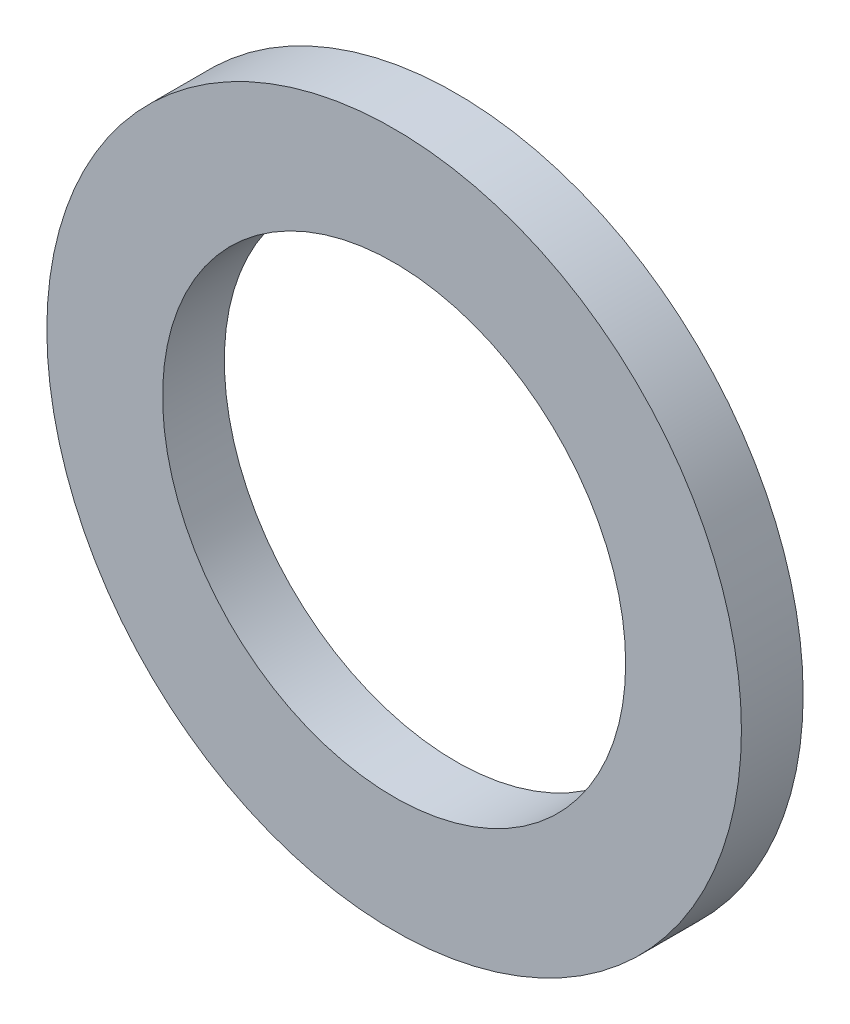
ISO-10303-21;
HEADER;
FILE_DESCRIPTION(('STEP AP214'),'2;1');
FILE_NAME('part.step','',(''),(''),'','','');
FILE_SCHEMA(('AUTOMOTIVE_DESIGN { 1 0 10303 214 1 1 1 1 }'));
ENDSEC;
DATA;
#1=APPLICATION_CONTEXT('core data for automotive mechanical design processes');
#2=APPLICATION_PROTOCOL_DEFINITION('international standard','automotive_design',2000,#1);
#3=PRODUCT_CONTEXT('',#1,'mechanical');
#4=PRODUCT('Part','Part','',(#3));
#5=PRODUCT_RELATED_PRODUCT_CATEGORY('part','',(#4));
#6=PRODUCT_DEFINITION_FORMATION('','',#4);
#7=PRODUCT_DEFINITION_CONTEXT('part definition',#1,'design');
#8=PRODUCT_DEFINITION('design','',#6,#7);
#9=PRODUCT_DEFINITION_SHAPE('','',#8);
#10=(LENGTH_UNIT() NAMED_UNIT(*) SI_UNIT(.MILLI.,.METRE.));
#11=(NAMED_UNIT(*) PLANE_ANGLE_UNIT() SI_UNIT($,.RADIAN.));
#12=(NAMED_UNIT(*) SI_UNIT($,.STERADIAN.) SOLID_ANGLE_UNIT());
#13=UNCERTAINTY_MEASURE_WITH_UNIT(LENGTH_MEASURE(1.E-05),#10,'distance_accuracy_value','');
#14=(GEOMETRIC_REPRESENTATION_CONTEXT(3) GLOBAL_UNCERTAINTY_ASSIGNED_CONTEXT((#13)) GLOBAL_UNIT_ASSIGNED_CONTEXT((#10,
#11,#12)) REPRESENTATION_CONTEXT('',''));
#15=CARTESIAN_POINT('',(0.,0.,0.));
#16=DIRECTION('',(0.,0.,1.));
#17=DIRECTION('',(1.,0.,0.));
#18=AXIS2_PLACEMENT_3D('',#15,#16,#17);
#19=CARTESIAN_POINT('',(0.,0.,0.));
#20=DIRECTION('',(0.,0.,-1.));
#21=DIRECTION('',(1.,0.,0.));
#22=AXIS2_PLACEMENT_3D('',#19,#20,#21);
#23=CYLINDRICAL_SURFACE('',#22,1.12499902);
#24=CARTESIAN_POINT('',(0.,0.,0.1999996));
#25=DIRECTION('',(0.,0.,1.));
#26=DIRECTION('',(1.,0.,0.));
#27=AXIS2_PLACEMENT_3D('',#24,#25,#26);
#28=CIRCLE('',#27,1.12499902);
#29=CARTESIAN_POINT('',(1.12499902,0.,0.1999996));
#30=VERTEX_POINT('',#29);
#31=EDGE_CURVE('E11',#30,#30,#28,.T.);
#32=ORIENTED_EDGE('',*,*,#31,.F.);
#33=DIRECTION('',(0.,0.,1.));
#34=VECTOR('',#33,1.);
#35=CARTESIAN_POINT('',(1.12499902,0.,0.));
#36=LINE('',#35,#34);
#37=CARTESIAN_POINT('',(1.12499902,0.,0.));
#38=VERTEX_POINT('',#37);
#39=EDGE_CURVE('E24',#38,#30,#36,.T.);
#40=ORIENTED_EDGE('',*,*,#39,.F.);
#41=CARTESIAN_POINT('',(0.,0.,0.));
#42=DIRECTION('',(0.,0.,1.));
#43=DIRECTION('',(1.,0.,0.));
#44=AXIS2_PLACEMENT_3D('',#41,#42,#43);
#45=CIRCLE('',#44,1.12499902);
#46=EDGE_CURVE('E46',#38,#38,#45,.T.);
#47=ORIENTED_EDGE('',*,*,#46,.T.);
#48=ORIENTED_EDGE('',*,*,#39,.T.);
#49=EDGE_LOOP('',(#32,#40,#47,#48));
#50=FACE_BOUND('',#49,.T.);
#51=ADVANCED_FACE('F17',(#50),#23,.T.);
#52=CARTESIAN_POINT('',(0.,0.,0.));
#53=DIRECTION('',(0.,0.,-1.));
#54=DIRECTION('',(1.,0.,0.));
#55=AXIS2_PLACEMENT_3D('',#52,#53,#54);
#56=CYLINDRICAL_SURFACE('',#55,0.7499985);
#57=DIRECTION('',(0.,0.,1.));
#58=VECTOR('',#57,1.);
#59=CARTESIAN_POINT('',(0.7499985,0.,0.));
#60=LINE('',#59,#58);
#61=CARTESIAN_POINT('',(0.7499985,0.,0.));
#62=VERTEX_POINT('',#61);
#63=CARTESIAN_POINT('',(0.7499985,0.,0.1999996));
#64=VERTEX_POINT('',#63);
#65=EDGE_CURVE('E40',#62,#64,#60,.T.);
#66=ORIENTED_EDGE('',*,*,#65,.T.);
#67=CARTESIAN_POINT('',(0.,0.,0.1999996));
#68=DIRECTION('',(0.,0.,1.));
#69=DIRECTION('',(1.,0.,0.));
#70=AXIS2_PLACEMENT_3D('',#67,#68,#69);
#71=CIRCLE('',#70,0.7499985);
#72=EDGE_CURVE('E45',#64,#64,#71,.T.);
#73=ORIENTED_EDGE('',*,*,#72,.T.);
#74=ORIENTED_EDGE('',*,*,#65,.F.);
#75=CARTESIAN_POINT('',(0.,0.,0.));
#76=DIRECTION('',(0.,0.,1.));
#77=DIRECTION('',(1.,0.,0.));
#78=AXIS2_PLACEMENT_3D('',#75,#76,#77);
#79=CIRCLE('',#78,0.7499985);
#80=EDGE_CURVE('E43',#62,#62,#79,.T.);
#81=ORIENTED_EDGE('',*,*,#80,.F.);
#82=EDGE_LOOP('',(#66,#73,#74,#81));
#83=FACE_BOUND('',#82,.T.);
#84=ADVANCED_FACE('F42',(#83),#56,.F.);
#85=CARTESIAN_POINT('',(1.12499902,0.,0.));
#86=DIRECTION('',(0.,0.,-1.));
#87=DIRECTION('',(-1.,0.,0.));
#88=AXIS2_PLACEMENT_3D('',#85,#86,#87);
#89=PLANE('',#88);
#90=ORIENTED_EDGE('',*,*,#46,.F.);
#91=EDGE_LOOP('',(#90));
#92=FACE_BOUND('',#91,.T.);
#93=ORIENTED_EDGE('',*,*,#80,.T.);
#94=EDGE_LOOP('',(#93));
#95=FACE_BOUND('',#94,.T.);
#96=ADVANCED_FACE('F49',(#92,#95),#89,.T.);
#97=CARTESIAN_POINT('',(1.12499902,0.,0.1999996));
#98=DIRECTION('',(0.,0.,-1.));
#99=DIRECTION('',(-1.,0.,0.));
#100=AXIS2_PLACEMENT_3D('',#97,#98,#99);
#101=PLANE('',#100);
#102=ORIENTED_EDGE('',*,*,#31,.T.);
#103=EDGE_LOOP('',(#102));
#104=FACE_BOUND('',#103,.T.);
#105=ORIENTED_EDGE('',*,*,#72,.F.);
#106=EDGE_LOOP('',(#105));
#107=FACE_BOUND('',#106,.T.);
#108=ADVANCED_FACE('F56',(#104,#107),#101,.F.);
#109=CLOSED_SHELL('',(#51,#84,#96,#108));
#110=MANIFOLD_SOLID_BREP('B1',#109);
#111=ADVANCED_BREP_SHAPE_REPRESENTATION('',(#18,#110),#14);
#112=SHAPE_DEFINITION_REPRESENTATION(#9,#111);
ENDSEC;
END-ISO-10303-21;
